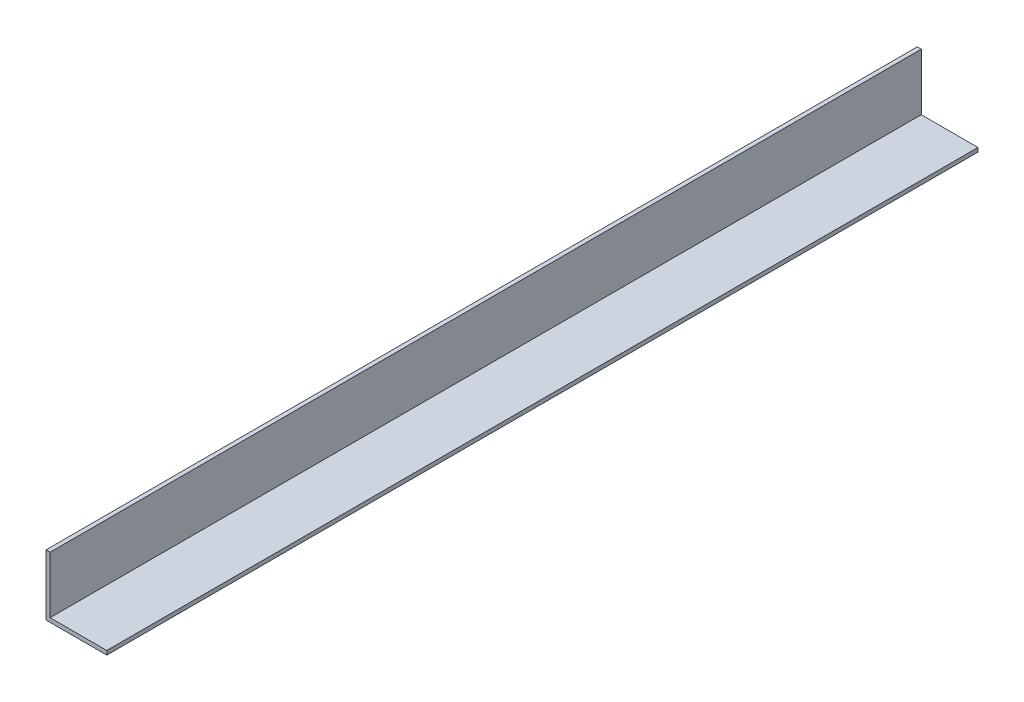
ISO-10303-21;
HEADER;
FILE_DESCRIPTION(('STEP AP214'),'2;1');
FILE_NAME('part.step','',(''),(''),'','','');
FILE_SCHEMA(('AUTOMOTIVE_DESIGN { 1 0 10303 214 1 1 1 1 }'));
ENDSEC;
DATA;
#1=APPLICATION_CONTEXT('core data for automotive mechanical design processes');
#2=APPLICATION_PROTOCOL_DEFINITION('international standard','automotive_design',2000,#1);
#3=PRODUCT_CONTEXT('',#1,'mechanical');
#4=PRODUCT('Part','Part','',(#3));
#5=PRODUCT_RELATED_PRODUCT_CATEGORY('part','',(#4));
#6=PRODUCT_DEFINITION_FORMATION('','',#4);
#7=PRODUCT_DEFINITION_CONTEXT('part definition',#1,'design');
#8=PRODUCT_DEFINITION('design','',#6,#7);
#9=PRODUCT_DEFINITION_SHAPE('','',#8);
#10=(LENGTH_UNIT() NAMED_UNIT(*) SI_UNIT(.MILLI.,.METRE.));
#11=(NAMED_UNIT(*) PLANE_ANGLE_UNIT() SI_UNIT($,.RADIAN.));
#12=(NAMED_UNIT(*) SI_UNIT($,.STERADIAN.) SOLID_ANGLE_UNIT());
#13=UNCERTAINTY_MEASURE_WITH_UNIT(LENGTH_MEASURE(1.E-05),#10,'distance_accuracy_value','');
#14=(GEOMETRIC_REPRESENTATION_CONTEXT(3) GLOBAL_UNCERTAINTY_ASSIGNED_CONTEXT((#13)) GLOBAL_UNIT_ASSIGNED_CONTEXT((#10,
#11,#12)) REPRESENTATION_CONTEXT('',''));
#15=CARTESIAN_POINT('',(0.,0.,0.));
#16=DIRECTION('',(0.,0.,1.));
#17=DIRECTION('',(1.,0.,0.));
#18=AXIS2_PLACEMENT_3D('',#15,#16,#17);
#19=CARTESIAN_POINT('',(30.,5.60231842899837,-19.999999999968));
#20=DIRECTION('',(0.,-1.,0.));
#21=DIRECTION('',(1.,0.,0.));
#22=AXIS2_PLACEMENT_3D('',#19,#20,#21);
#23=PLANE('',#22);
#24=DIRECTION('',(0.,0.,1.));
#25=VECTOR('',#24,1.);
#26=CARTESIAN_POINT('',(30.,5.60231842899837,-19.999999999968));
#27=LINE('',#26,#25);
#28=CARTESIAN_POINT('',(30.,5.60231842899837,-19.999999999968));
#29=VERTEX_POINT('',#28);
#30=CARTESIAN_POINT('',(30.,5.60231842899837,410.));
#31=VERTEX_POINT('',#30);
#32=EDGE_CURVE('E39',#29,#31,#27,.T.);
#33=ORIENTED_EDGE('',*,*,#32,.T.);
#34=DIRECTION('',(1.,0.,0.));
#35=VECTOR('',#34,1.);
#36=CARTESIAN_POINT('',(30.,5.60231842899837,410.));
#37=LINE('',#36,#35);
#38=CARTESIAN_POINT('',(0.,5.60231842899837,410.));
#39=VERTEX_POINT('',#38);
#40=EDGE_CURVE('E88',#39,#31,#37,.T.);
#41=ORIENTED_EDGE('',*,*,#40,.F.);
#42=DIRECTION('',(0.,0.,1.));
#43=VECTOR('',#42,1.);
#44=CARTESIAN_POINT('',(0.,5.60231842899837,-19.999999999968));
#45=LINE('',#44,#43);
#46=CARTESIAN_POINT('',(0.,5.60231842899837,-19.999999999968));
#47=VERTEX_POINT('',#46);
#48=EDGE_CURVE('E11',#47,#39,#45,.T.);
#49=ORIENTED_EDGE('',*,*,#48,.F.);
#50=DIRECTION('',(1.,0.,0.));
#51=VECTOR('',#50,1.);
#52=CARTESIAN_POINT('',(30.,5.60231842899837,-19.999999999968));
#53=LINE('',#52,#51);
#54=EDGE_CURVE('E89',#47,#29,#53,.T.);
#55=ORIENTED_EDGE('',*,*,#54,.T.);
#56=EDGE_LOOP('',(#33,#41,#49,#55));
#57=FACE_BOUND('',#56,.T.);
#58=ADVANCED_FACE('F36',(#57),#23,.T.);
#59=CARTESIAN_POINT('',(0.,5.60231842899837,-19.999999999968));
#60=DIRECTION('',(-1.,0.,0.));
#61=DIRECTION('',(0.,0.,1.));
#62=AXIS2_PLACEMENT_3D('',#59,#60,#61);
#63=PLANE('',#62);
#64=ORIENTED_EDGE('',*,*,#48,.T.);
#65=DIRECTION('',(0.,-1.,0.));
#66=VECTOR('',#65,1.);
#67=CARTESIAN_POINT('',(0.,5.60231842899837,410.));
#68=LINE('',#67,#66);
#69=CARTESIAN_POINT('',(0.,35.6023184289984,410.));
#70=VERTEX_POINT('',#69);
#71=EDGE_CURVE('E106',#70,#39,#68,.T.);
#72=ORIENTED_EDGE('',*,*,#71,.F.);
#73=DIRECTION('',(0.,0.,1.));
#74=VECTOR('',#73,1.);
#75=CARTESIAN_POINT('',(0.,35.6023184289984,-19.999999999968));
#76=LINE('',#75,#74);
#77=CARTESIAN_POINT('',(0.,35.6023184289984,-19.999999999968));
#78=VERTEX_POINT('',#77);
#79=EDGE_CURVE('E44',#78,#70,#76,.T.);
#80=ORIENTED_EDGE('',*,*,#79,.F.);
#81=DIRECTION('',(0.,-1.,0.));
#82=VECTOR('',#81,1.);
#83=CARTESIAN_POINT('',(0.,5.60231842899837,-19.999999999968));
#84=LINE('',#83,#82);
#85=EDGE_CURVE('E94',#78,#47,#84,.T.);
#86=ORIENTED_EDGE('',*,*,#85,.T.);
#87=EDGE_LOOP('',(#64,#72,#80,#86));
#88=FACE_BOUND('',#87,.T.);
#89=ADVANCED_FACE('F146',(#88),#63,.T.);
#90=CARTESIAN_POINT('',(0.,35.6023184289984,-19.999999999968));
#91=DIRECTION('',(0.,1.,0.));
#92=DIRECTION('',(0.,0.,1.));
#93=AXIS2_PLACEMENT_3D('',#90,#91,#92);
#94=PLANE('',#93);
#95=ORIENTED_EDGE('',*,*,#79,.T.);
#96=DIRECTION('',(-1.,0.,0.));
#97=VECTOR('',#96,1.);
#98=CARTESIAN_POINT('',(0.,35.6023184289984,410.));
#99=LINE('',#98,#97);
#100=CARTESIAN_POINT('',(2.,35.6023184289984,410.));
#101=VERTEX_POINT('',#100);
#102=EDGE_CURVE('E113',#101,#70,#99,.T.);
#103=ORIENTED_EDGE('',*,*,#102,.F.);
#104=DIRECTION('',(0.,0.,1.));
#105=VECTOR('',#104,1.);
#106=CARTESIAN_POINT('',(2.,35.6023184289984,-19.999999999968));
#107=LINE('',#106,#105);
#108=CARTESIAN_POINT('',(2.,35.6023184289984,-19.999999999968));
#109=VERTEX_POINT('',#108);
#110=EDGE_CURVE('E129',#109,#101,#107,.T.);
#111=ORIENTED_EDGE('',*,*,#110,.F.);
#112=DIRECTION('',(-1.,0.,0.));
#113=VECTOR('',#112,1.);
#114=CARTESIAN_POINT('',(0.,35.6023184289984,-19.999999999968));
#115=LINE('',#114,#113);
#116=EDGE_CURVE('E125',#109,#78,#115,.T.);
#117=ORIENTED_EDGE('',*,*,#116,.T.);
#118=EDGE_LOOP('',(#95,#103,#111,#117));
#119=FACE_BOUND('',#118,.T.);
#120=ADVANCED_FACE('F142',(#119),#94,.T.);
#121=CARTESIAN_POINT('',(2.,35.6023184289984,-19.999999999968));
#122=DIRECTION('',(1.,0.,0.));
#123=DIRECTION('',(0.,1.,0.));
#124=AXIS2_PLACEMENT_3D('',#121,#122,#123);
#125=PLANE('',#124);
#126=ORIENTED_EDGE('',*,*,#110,.T.);
#127=DIRECTION('',(0.,1.,0.));
#128=VECTOR('',#127,1.);
#129=CARTESIAN_POINT('',(2.,35.6023184289984,410.));
#130=LINE('',#129,#128);
#131=CARTESIAN_POINT('',(2.,7.60231842899837,410.));
#132=VERTEX_POINT('',#131);
#133=EDGE_CURVE('E110',#132,#101,#130,.T.);
#134=ORIENTED_EDGE('',*,*,#133,.F.);
#135=DIRECTION('',(0.,0.,1.));
#136=VECTOR('',#135,1.);
#137=CARTESIAN_POINT('',(2.,7.60231842899837,-19.999999999968));
#138=LINE('',#137,#136);
#139=CARTESIAN_POINT('',(2.,7.60231842899837,-19.999999999968));
#140=VERTEX_POINT('',#139);
#141=EDGE_CURVE('E131',#140,#132,#138,.T.);
#142=ORIENTED_EDGE('',*,*,#141,.F.);
#143=DIRECTION('',(0.,1.,0.));
#144=VECTOR('',#143,1.);
#145=CARTESIAN_POINT('',(2.,35.6023184289984,-19.999999999968));
#146=LINE('',#145,#144);
#147=EDGE_CURVE('E122',#140,#109,#146,.T.);
#148=ORIENTED_EDGE('',*,*,#147,.T.);
#149=EDGE_LOOP('',(#126,#134,#142,#148));
#150=FACE_BOUND('',#149,.T.);
#151=ADVANCED_FACE('F139',(#150),#125,.T.);
#152=CARTESIAN_POINT('',(2.,7.60231842899837,-19.999999999968));
#153=DIRECTION('',(0.,1.,0.));
#154=DIRECTION('',(0.,0.,1.));
#155=AXIS2_PLACEMENT_3D('',#152,#153,#154);
#156=PLANE('',#155);
#157=ORIENTED_EDGE('',*,*,#141,.T.);
#158=DIRECTION('',(-1.,0.,0.));
#159=VECTOR('',#158,1.);
#160=CARTESIAN_POINT('',(2.,7.60231842899837,410.));
#161=LINE('',#160,#159);
#162=CARTESIAN_POINT('',(30.,7.60231842899837,410.));
#163=VERTEX_POINT('',#162);
#164=EDGE_CURVE('E101',#163,#132,#161,.T.);
#165=ORIENTED_EDGE('',*,*,#164,.F.);
#166=DIRECTION('',(0.,0.,1.));
#167=VECTOR('',#166,1.);
#168=CARTESIAN_POINT('',(30.,7.60231842899837,-19.999999999968));
#169=LINE('',#168,#167);
#170=CARTESIAN_POINT('',(30.,7.60231842899837,-19.999999999968));
#171=VERTEX_POINT('',#170);
#172=EDGE_CURVE('E93',#171,#163,#169,.T.);
#173=ORIENTED_EDGE('',*,*,#172,.F.);
#174=DIRECTION('',(-1.,0.,0.));
#175=VECTOR('',#174,1.);
#176=CARTESIAN_POINT('',(2.,7.60231842899837,-19.999999999968));
#177=LINE('',#176,#175);
#178=EDGE_CURVE('E119',#171,#140,#177,.T.);
#179=ORIENTED_EDGE('',*,*,#178,.T.);
#180=EDGE_LOOP('',(#157,#165,#173,#179));
#181=FACE_BOUND('',#180,.T.);
#182=ADVANCED_FACE('F133',(#181),#156,.T.);
#183=CARTESIAN_POINT('',(30.,7.60231842899837,-19.999999999968));
#184=DIRECTION('',(1.,0.,0.));
#185=DIRECTION('',(0.,0.,-1.));
#186=AXIS2_PLACEMENT_3D('',#183,#184,#185);
#187=PLANE('',#186);
#188=ORIENTED_EDGE('',*,*,#172,.T.);
#189=DIRECTION('',(0.,1.,0.));
#190=VECTOR('',#189,1.);
#191=CARTESIAN_POINT('',(30.,7.60231842899837,410.));
#192=LINE('',#191,#190);
#193=EDGE_CURVE('E96',#31,#163,#192,.T.);
#194=ORIENTED_EDGE('',*,*,#193,.F.);
#195=ORIENTED_EDGE('',*,*,#32,.F.);
#196=DIRECTION('',(0.,1.,0.));
#197=VECTOR('',#196,1.);
#198=CARTESIAN_POINT('',(30.,7.60231842899837,-19.999999999968));
#199=LINE('',#198,#197);
#200=EDGE_CURVE('E117',#29,#171,#199,.T.);
#201=ORIENTED_EDGE('',*,*,#200,.T.);
#202=EDGE_LOOP('',(#188,#194,#195,#201));
#203=FACE_BOUND('',#202,.T.);
#204=ADVANCED_FACE('F97',(#203),#187,.T.);
#205=CARTESIAN_POINT('',(0.,0.,-19.999999999968));
#206=DIRECTION('',(0.,0.,-1.));
#207=DIRECTION('',(-1.,0.,0.));
#208=AXIS2_PLACEMENT_3D('',#205,#206,#207);
#209=PLANE('',#208);
#210=ORIENTED_EDGE('',*,*,#54,.F.);
#211=ORIENTED_EDGE('',*,*,#85,.F.);
#212=ORIENTED_EDGE('',*,*,#116,.F.);
#213=ORIENTED_EDGE('',*,*,#147,.F.);
#214=ORIENTED_EDGE('',*,*,#178,.F.);
#215=ORIENTED_EDGE('',*,*,#200,.F.);
#216=EDGE_LOOP('',(#210,#211,#212,#213,#214,#215));
#217=FACE_BOUND('',#216,.T.);
#218=ADVANCED_FACE('F145',(#217),#209,.T.);
#219=CARTESIAN_POINT('',(0.,0.,410.));
#220=DIRECTION('',(0.,0.,-1.));
#221=DIRECTION('',(-1.,0.,0.));
#222=AXIS2_PLACEMENT_3D('',#219,#220,#221);
#223=PLANE('',#222);
#224=ORIENTED_EDGE('',*,*,#40,.T.);
#225=ORIENTED_EDGE('',*,*,#193,.T.);
#226=ORIENTED_EDGE('',*,*,#164,.T.);
#227=ORIENTED_EDGE('',*,*,#133,.T.);
#228=ORIENTED_EDGE('',*,*,#102,.T.);
#229=ORIENTED_EDGE('',*,*,#71,.T.);
#230=EDGE_LOOP('',(#224,#225,#226,#227,#228,#229));
#231=FACE_BOUND('',#230,.T.);
#232=ADVANCED_FACE('F104',(#231),#223,.F.);
#233=CLOSED_SHELL('',(#58,#89,#120,#151,#182,#204,#218,#232));
#234=MANIFOLD_SOLID_BREP('B2',#233);
#235=ADVANCED_BREP_SHAPE_REPRESENTATION('',(#18,#234),#14);
#236=SHAPE_DEFINITION_REPRESENTATION(#9,#235);
ENDSEC;
END-ISO-10303-21;
